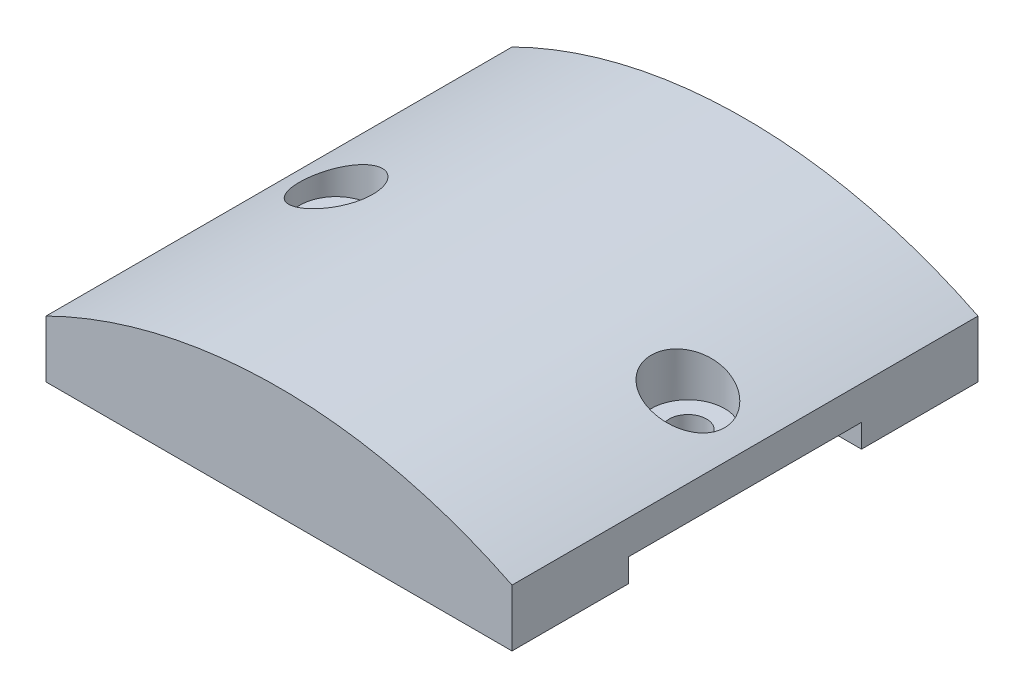
ISO-10303-21;
HEADER;
FILE_DESCRIPTION(('STEP AP214'),'2;1');
FILE_NAME('part.step','',(''),(''),'','','');
FILE_SCHEMA(('AUTOMOTIVE_DESIGN { 1 0 10303 214 1 1 1 1 }'));
ENDSEC;
DATA;
#1=APPLICATION_CONTEXT('core data for automotive mechanical design processes');
#2=APPLICATION_PROTOCOL_DEFINITION('international standard','automotive_design',2000,#1);
#3=PRODUCT_CONTEXT('',#1,'mechanical');
#4=PRODUCT('Part','Part','',(#3));
#5=PRODUCT_RELATED_PRODUCT_CATEGORY('part','',(#4));
#6=PRODUCT_DEFINITION_FORMATION('','',#4);
#7=PRODUCT_DEFINITION_CONTEXT('part definition',#1,'design');
#8=PRODUCT_DEFINITION('design','',#6,#7);
#9=PRODUCT_DEFINITION_SHAPE('','',#8);
#10=(LENGTH_UNIT() NAMED_UNIT(*) SI_UNIT(.MILLI.,.METRE.));
#11=(NAMED_UNIT(*) PLANE_ANGLE_UNIT() SI_UNIT($,.RADIAN.));
#12=(NAMED_UNIT(*) SI_UNIT($,.STERADIAN.) SOLID_ANGLE_UNIT());
#13=UNCERTAINTY_MEASURE_WITH_UNIT(LENGTH_MEASURE(1.E-05),#10,'distance_accuracy_value','');
#14=(GEOMETRIC_REPRESENTATION_CONTEXT(3) GLOBAL_UNCERTAINTY_ASSIGNED_CONTEXT((#13)) GLOBAL_UNIT_ASSIGNED_CONTEXT((#10,
#11,#12)) REPRESENTATION_CONTEXT('',''));
#15=CARTESIAN_POINT('',(0.,0.,0.));
#16=DIRECTION('',(0.,0.,1.));
#17=DIRECTION('',(1.,0.,0.));
#18=AXIS2_PLACEMENT_3D('',#15,#16,#17);
#19=CARTESIAN_POINT('',(-20.,37.4112887414927,40.));
#20=DIRECTION('',(0.,1.,0.));
#21=DIRECTION('',(0.,0.,1.));
#22=AXIS2_PLACEMENT_3D('',#19,#20,#21);
#23=PLANE('',#22);
#24=CARTESIAN_POINT('',(15.1,37.4112887414927,20.));
#25=DIRECTION('',(0.,-1.,0.));
#26=DIRECTION('',(0.,0.,-1.));
#27=AXIS2_PLACEMENT_3D('',#24,#25,#26);
#28=CIRCLE('',#27,1.6);
#29=CARTESIAN_POINT('',(15.1,37.4112887414927,18.4));
#30=VERTEX_POINT('',#29);
#31=EDGE_CURVE('E180',#30,#30,#28,.T.);
#32=ORIENTED_EDGE('',*,*,#31,.F.);
#33=EDGE_LOOP('',(#32));
#34=FACE_BOUND('',#33,.T.);
#35=CARTESIAN_POINT('',(-15.1,37.4112887414927,20.));
#36=DIRECTION('',(0.,-1.,0.));
#37=DIRECTION('',(0.,0.,-1.));
#38=AXIS2_PLACEMENT_3D('',#35,#36,#37);
#39=CIRCLE('',#38,1.6);
#40=CARTESIAN_POINT('',(-15.1,37.4112887414927,18.4));
#41=VERTEX_POINT('',#40);
#42=EDGE_CURVE('E184',#41,#41,#39,.T.);
#43=ORIENTED_EDGE('',*,*,#42,.F.);
#44=EDGE_LOOP('',(#43));
#45=FACE_BOUND('',#44,.T.);
#46=DIRECTION('',(-1.,0.,0.));
#47=VECTOR('',#46,1.);
#48=CARTESIAN_POINT('',(20.,37.4112887414927,10.));
#49=LINE('',#48,#47);
#50=CARTESIAN_POINT('',(20.,37.4112887414927,10.));
#51=VERTEX_POINT('',#50);
#52=CARTESIAN_POINT('',(-20.,37.4112887414927,10.));
#53=VERTEX_POINT('',#52);
#54=EDGE_CURVE('E53',#51,#53,#49,.T.);
#55=ORIENTED_EDGE('',*,*,#54,.F.);
#56=DIRECTION('',(0.,0.,-1.));
#57=VECTOR('',#56,1.);
#58=CARTESIAN_POINT('',(20.,37.4112887414927,40.));
#59=LINE('',#58,#57);
#60=CARTESIAN_POINT('',(20.,37.4112887414927,30.));
#61=VERTEX_POINT('',#60);
#62=EDGE_CURVE('E119',#61,#51,#59,.T.);
#63=ORIENTED_EDGE('',*,*,#62,.F.);
#64=DIRECTION('',(1.,0.,0.));
#65=VECTOR('',#64,1.);
#66=CARTESIAN_POINT('',(20.,37.4112887414927,30.));
#67=LINE('',#66,#65);
#68=CARTESIAN_POINT('',(-20.,37.4112887414927,30.));
#69=VERTEX_POINT('',#68);
#70=EDGE_CURVE('E120',#69,#61,#67,.T.);
#71=ORIENTED_EDGE('',*,*,#70,.F.);
#72=DIRECTION('',(0.,0.,-1.));
#73=VECTOR('',#72,1.);
#74=CARTESIAN_POINT('',(-20.,37.4112887414927,40.));
#75=LINE('',#74,#73);
#76=EDGE_CURVE('E43',#69,#53,#75,.T.);
#77=ORIENTED_EDGE('',*,*,#76,.T.);
#78=EDGE_LOOP('',(#55,#63,#71,#77));
#79=FACE_BOUND('',#78,.T.);
#80=ADVANCED_FACE('F35',(#34,#45,#79),#23,.F.);
#81=CARTESIAN_POINT('',(0.,0.,40.));
#82=DIRECTION('',(0.,0.,-1.));
#83=DIRECTION('',(-1.,0.,0.));
#84=AXIS2_PLACEMENT_3D('',#81,#82,#83);
#85=CYLINDRICAL_SURFACE('',#84,45.);
#86=CARTESIAN_POINT('',(15.1,42.3909188388268,16.85));
#87=CARTESIAN_POINT('',(14.917921162433,42.4557751359919,16.8500064354396));
#88=CARTESIAN_POINT('',(14.7353063218418,42.5194905619272,16.8658227416837));
#89=CARTESIAN_POINT('',(14.3741346155636,42.6429451034299,16.9292855592987));
#90=CARTESIAN_POINT('',(14.1955817473311,42.7026804048673,16.9769621331173));
#91=CARTESIAN_POINT('',(13.847741264861,42.8167444908639,17.103684490772));
#92=CARTESIAN_POINT('',(13.6784678605518,42.8710650823666,17.1827769353212));
#93=CARTESIAN_POINT('',(13.3551221756986,42.9728922456674,17.3707702781144));
#94=CARTESIAN_POINT('',(13.2010442954167,43.0204013305405,17.4796601393828));
#95=CARTESIAN_POINT('',(12.9189423413911,43.1059379927211,17.7199711002173));
#96=CARTESIAN_POINT('',(12.7901603329951,43.1442533330929,17.8503992451927));
#97=CARTESIAN_POINT('',(12.5563761210181,43.2128719655159,18.1328991703156));
#98=CARTESIAN_POINT('',(12.4513684397311,43.2431771034218,18.284965951653));
#99=CARTESIAN_POINT('',(12.2732307987915,43.2940646322592,18.5989379034497));
#100=CARTESIAN_POINT('',(12.1988724088376,43.3150252294352,18.760085493556));
#101=CARTESIAN_POINT('',(12.0781068182708,43.3488558264082,19.0933300262607));
#102=CARTESIAN_POINT('',(12.0316942010325,43.3617273940928,19.265424839845));
#103=CARTESIAN_POINT('',(11.9694548412235,43.3789484461706,19.6101757891508));
#104=CARTESIAN_POINT('',(11.9527621965356,43.3835392481825,19.7826640537202));
#105=CARTESIAN_POINT('',(11.9478702820662,43.3848868478971,20.1280676332819));
#106=CARTESIAN_POINT('',(11.9596684319076,43.381644355052,20.3009829081834));
#107=CARTESIAN_POINT('',(12.0110599112159,43.3674431511606,20.640387344238));
#108=CARTESIAN_POINT('',(12.0503532095443,43.3565677279551,20.8069255909907));
#109=CARTESIAN_POINT('',(12.1550690359214,43.3273265891101,21.1308663340762));
#110=CARTESIAN_POINT('',(12.2204916292976,43.3089608547435,21.2882688075671));
#111=CARTESIAN_POINT('',(12.3758678439609,43.2648175111449,21.5908307864634));
#112=CARTESIAN_POINT('',(12.4660017952911,43.2389853376347,21.7358895987553));
#113=CARTESIAN_POINT('',(12.6676319914819,43.1803438237324,22.0086976141677));
#114=CARTESIAN_POINT('',(12.7791301407995,43.1475338612944,22.1364452723949));
#115=CARTESIAN_POINT('',(13.023047495167,43.0745493728572,22.374560845027));
#116=CARTESIAN_POINT('',(13.1559217157993,43.0342106139224,22.4844118250061));
#117=CARTESIAN_POINT('',(13.4363869906596,42.9474683512401,22.6803305244605));
#118=CARTESIAN_POINT('',(13.5839805819532,42.9010638015489,22.7663941342134));
#119=CARTESIAN_POINT('',(13.8958741094954,42.8010810095133,22.9161102700115));
#120=CARTESIAN_POINT('',(14.0606086563789,42.7472882800563,22.97871339931));
#121=CARTESIAN_POINT('',(14.3967693526546,42.6352487919911,23.0754808994123));
#122=CARTESIAN_POINT('',(14.5681970584752,42.5770009943441,23.1096386137813));
#123=CARTESIAN_POINT('',(14.9214726795755,42.4545193440612,23.1501935375199));
#124=CARTESIAN_POINT('',(15.1034283496834,42.3901325432662,23.1551928316704));
#125=CARTESIAN_POINT('',(15.4648938317966,42.2596027134132,23.1340311888419));
#126=CARTESIAN_POINT('',(15.6444030415979,42.1934592633567,23.1078627150956));
#127=CARTESIAN_POINT('',(16.0027077688299,42.0589022597986,23.0236878442042));
#128=CARTESIAN_POINT('',(16.1812444826261,41.9904927898198,22.964568171481));
#129=CARTESIAN_POINT('',(16.5257817195087,41.8560959125334,22.8151220990332));
#130=CARTESIAN_POINT('',(16.691780640312,41.7901088153479,22.724791718892));
#131=CARTESIAN_POINT('',(17.0060463070567,41.6632102259937,22.514979912102));
#132=CARTESIAN_POINT('',(17.1543400429,41.6022910523756,22.3955437222389));
#133=CARTESIAN_POINT('',(17.4284539867978,41.4882039340175,22.1300630340163));
#134=CARTESIAN_POINT('',(17.5542806853583,41.4350337514887,21.9840262450164));
#135=CARTESIAN_POINT('',(17.7723619962926,41.341945863629,21.6776187455801));
#136=CARTESIAN_POINT('',(17.8660664570793,41.3014661158964,21.5184537478712));
#137=CARTESIAN_POINT('',(18.0248385245567,41.2324235274573,21.1840637020472));
#138=CARTESIAN_POINT('',(18.0899249056515,41.2038528746337,21.0088492743386));
#139=CARTESIAN_POINT('',(18.1841906728487,41.1623328865027,20.6630828080986));
#140=CARTESIAN_POINT('',(18.2159026241262,41.148283517025,20.4933514903046));
#141=CARTESIAN_POINT('',(18.2511166924421,41.1326772356729,20.1504411089416));
#142=CARTESIAN_POINT('',(18.2546297306281,41.1311154874728,19.9772634061744));
#143=CARTESIAN_POINT('',(18.2338972771202,41.1403096900502,19.6425838061022));
#144=CARTESIAN_POINT('',(18.2111756035592,41.1503894634211,19.4809656972016));
#145=CARTESIAN_POINT('',(18.1414074235976,41.1811944356611,19.1641460807923));
#146=CARTESIAN_POINT('',(18.0943607880927,41.201919691031,19.0089446073445));
#147=CARTESIAN_POINT('',(17.9772301319571,41.2531609788929,18.7075443839803));
#148=CARTESIAN_POINT('',(17.9069339320577,41.2837671221187,18.5614438575329));
#149=CARTESIAN_POINT('',(17.7459092207638,41.3532389655789,18.2831636854008));
#150=CARTESIAN_POINT('',(17.6551765703296,41.3921063388887,18.150986867686));
#151=CARTESIAN_POINT('',(17.4497436989419,41.4791469123823,17.8952987367199));
#152=CARTESIAN_POINT('',(17.3338920891559,41.5277526599914,17.7728610952463));
#153=CARTESIAN_POINT('',(17.0855884575112,41.6305262958042,17.5488930855934));
#154=CARTESIAN_POINT('',(16.9531269189506,41.6846973694348,17.4473747920629));
#155=CARTESIAN_POINT('',(16.6640135366599,41.8011577382072,17.2598638916752));
#156=CARTESIAN_POINT('',(16.5062773516966,41.8637502912335,17.1757313857386));
#157=CARTESIAN_POINT('',(16.1797325558968,41.9910334508196,17.0355075399543));
#158=CARTESIAN_POINT('',(16.0109323976939,42.0557224370805,16.9793950694846));
#159=CARTESIAN_POINT('',(15.718014495221,42.1658715545149,16.9087222464358));
#160=CARTESIAN_POINT('',(15.5956192419095,42.2113007476435,16.8867555131053));
#161=CARTESIAN_POINT('',(15.3488996785549,42.3016376037237,16.8573919009266));
#162=CARTESIAN_POINT('',(15.2245752925897,42.3465452460272,16.8499955969799));
#163=CARTESIAN_POINT('',(15.1,42.3909188388268,16.85));
#164=B_SPLINE_CURVE_WITH_KNOTS('',3,(#86,#87,#88,#89,#90,#91,#92,#93,#94,#95,#96,#97,#98,#99,
#100,#101,#102,#103,#104,#105,#106,#107,#108,#109,#110,#111,#112,#113,#114,#115,#116,#117,#118,
#119,#120,#121,#122,#123,#124,#125,#126,#127,#128,#129,#130,#131,#132,#133,#134,#135,#136,#137,
#138,#139,#140,#141,#142,#143,#144,#145,#146,#147,#148,#149,#150,#151,#152,#153,#154,#155,#156,
#157,#158,#159,#160,#161,#162,#163),.UNSPECIFIED.,.T.,.F.,(4,2,2,2,2,2,2,2,2,2,2,2,2,2,2,2,2,2,
2,2,2,2,2,2,2,2,2,2,2,2,2,2,2,2,2,2,2,2,4),(0.,0.579395684925988,1.159338844628,
1.74014661062104,2.3207395356927,2.87965661111088,3.43844477830876,3.97192347129547,
4.50529872877518,5.02286260412831,5.54037960610012,6.05233570748208,6.56429308884739,
7.08009074524877,7.59593440252669,8.12473051713854,8.65361793435104,9.20393576786858,
9.7543823436217,10.3310145919905,10.9077863057725,11.5053415324013,12.1029729955964,
12.6996814674976,13.2962172763012,13.8604245885577,14.4242612079383,14.9412844575764,
15.4581074597871,15.946359315351,16.4346137623279,16.9274530601218,17.4203922636516,
17.9444476355004,18.4688046500611,19.0345858023868,19.5999396379469,19.9963368260331,
20.3927496543404),.UNSPECIFIED.);
#165=CARTESIAN_POINT('',(15.1,42.3909188388268,16.85));
#166=VERTEX_POINT('',#165);
#167=EDGE_CURVE('E146',#166,#166,#164,.T.);
#168=ORIENTED_EDGE('',*,*,#167,.F.);
#169=EDGE_LOOP('',(#168));
#170=FACE_BOUND('',#169,.T.);
#171=CARTESIAN_POINT('',(-15.1,42.3909188388268,16.85));
#172=CARTESIAN_POINT('',(-15.2881124933887,42.3239094742285,16.8500072405214));
#173=CARTESIAN_POINT('',(-15.4759275591287,42.2555840182287,16.8668931099648));
#174=CARTESIAN_POINT('',(-15.8455928341878,42.1183595938039,16.9337365806963));
#175=CARTESIAN_POINT('',(-16.0274334172963,42.0494599044929,16.9837450467161));
#176=CARTESIAN_POINT('',(-16.3799166486515,41.9134108283723,17.1156104386975));
#177=CARTESIAN_POINT('',(-16.5505596591366,41.8462613849852,17.1974663338097));
#178=CARTESIAN_POINT('',(-16.8756017351511,41.7162405786856,17.3912600023276));
#179=CARTESIAN_POINT('',(-17.0300062638385,41.6533677795006,17.5031876132823));
#180=CARTESIAN_POINT('',(-17.3149832665825,41.5357042230986,17.7524395200131));
#181=CARTESIAN_POINT('',(-17.4459367428031,41.4807877066122,17.8892671015941));
#182=CARTESIAN_POINT('',(-17.6824993915352,41.3804998452969,18.1863836138832));
#183=CARTESIAN_POINT('',(-17.7881189079361,41.3351246056886,18.3466629260342));
#184=CARTESIAN_POINT('',(-17.9630436364983,41.2593934751678,18.6742814139124));
#185=CARTESIAN_POINT('',(-18.0343665192322,41.2282113044505,18.8403503114985));
#186=CARTESIAN_POINT('',(-18.1478202358163,41.1783986352912,19.1839367297323));
#187=CARTESIAN_POINT('',(-18.1899693621524,41.1597602718528,19.3614469999532));
#188=CARTESIAN_POINT('',(-18.2408739082115,41.137224275827,19.7075324610461));
#189=CARTESIAN_POINT('',(-18.2520268029631,41.1322685530485,19.8756895041256));
#190=CARTESIAN_POINT('',(-18.2473693471447,41.1343351258476,20.2115352230956));
#191=CARTESIAN_POINT('',(-18.2315653214583,41.1413546116903,20.3792239996091));
#192=CARTESIAN_POINT('',(-18.1747081431594,41.1665019746474,20.7034581008569));
#193=CARTESIAN_POINT('',(-18.1345289797678,41.1842452625123,20.8601884799997));
#194=CARTESIAN_POINT('',(-18.0312948370746,41.2295471978183,21.164396956171));
#195=CARTESIAN_POINT('',(-17.9682375027795,41.2571068557145,21.3118740988723));
#196=CARTESIAN_POINT('',(-17.8191448904608,41.3217237611645,21.5986557537818));
#197=CARTESIAN_POINT('',(-17.7324403983181,41.3590560942391,21.7375491272159));
#198=CARTESIAN_POINT('',(-17.5399145900048,41.4410705577026,21.998921786049));
#199=CARTESIAN_POINT('',(-17.4340875964544,41.485754870506,22.1213961778686));
#200=CARTESIAN_POINT('',(-17.1978927177011,41.5842518504236,22.3560684520519));
#201=CARTESIAN_POINT('',(-17.0662908796495,41.638494596772,22.4668433687524));
#202=CARTESIAN_POINT('',(-16.7881681015295,41.7514065129923,22.664913598653));
#203=CARTESIAN_POINT('',(-16.6416418856634,41.8100772462547,22.7522005688282));
#204=CARTESIAN_POINT('',(-16.326084479267,41.9343503611774,22.9072909501269));
#205=CARTESIAN_POINT('',(-16.1561907061596,42.0001451975729,22.9731894877233));
#206=CARTESIAN_POINT('',(-15.8078614471808,42.1324844412606,23.0747953013084));
#207=CARTESIAN_POINT('',(-15.629423851712,42.199029030544,23.1104950797292));
#208=CARTESIAN_POINT('',(-15.2619700767349,42.3333424478927,23.1514549150258));
#209=CARTESIAN_POINT('',(-15.0728059740975,42.4010666134936,23.1555500776055));
#210=CARTESIAN_POINT('',(-14.6956465775453,42.5332564407386,23.1296521308203));
#211=CARTESIAN_POINT('',(-14.5076512716343,42.5977221358751,23.0996593719049));
#212=CARTESIAN_POINT('',(-14.1407804894186,42.7209004657908,23.0062919303004));
#213=CARTESIAN_POINT('',(-13.961822875223,42.779672645715,22.9433204603148));
#214=CARTESIAN_POINT('',(-13.6165167261907,42.8908309412006,22.7852829268663));
#215=CARTESIAN_POINT('',(-13.450165141238,42.943218603418,22.6902246575832));
#216=CARTESIAN_POINT('',(-13.142864944297,43.0382375170427,22.4750282174879));
#217=CARTESIAN_POINT('',(-13.0011246684806,43.0811947144011,22.356165218644));
#218=CARTESIAN_POINT('',(-12.7396351905537,43.1592440710589,22.0941356006051));
#219=CARTESIAN_POINT('',(-12.6198796326398,43.1943385041399,21.9509760286794));
#220=CARTESIAN_POINT('',(-12.4119968604404,43.254520265744,21.6518809203537));
#221=CARTESIAN_POINT('',(-12.3226273392947,43.2800070985417,21.4968885531198));
#222=CARTESIAN_POINT('',(-12.171125978643,43.3228568752059,21.1730831344086));
#223=CARTESIAN_POINT('',(-12.1089882378382,43.3402215792441,21.0042730867295));
#224=CARTESIAN_POINT('',(-12.0158857779409,43.3661245298059,20.6639240680891));
#225=CARTESIAN_POINT('',(-11.9839200218119,43.3749464866356,20.4926799183945));
#226=CARTESIAN_POINT('',(-11.9486445746038,43.3846774861953,20.1470492932151));
#227=CARTESIAN_POINT('',(-11.9453315995885,43.3855874357318,19.972663180131));
#228=CARTESIAN_POINT('',(-11.9672981537529,43.3795330833994,19.6286105455623));
#229=CARTESIAN_POINT('',(-11.992128762669,43.3726924128213,19.4589129332231));
#230=CARTESIAN_POINT('',(-12.0687993275228,43.3514203787888,19.1262386345274));
#231=CARTESIAN_POINT('',(-12.1206388074132,43.3369891491223,18.9632618297674));
#232=CARTESIAN_POINT('',(-12.249750616349,43.3006707870141,18.6480898579962));
#233=CARTESIAN_POINT('',(-12.3270926911493,43.2787632020566,18.4959256647063));
#234=CARTESIAN_POINT('',(-12.5046050755418,43.2278075661563,18.2069041649482));
#235=CARTESIAN_POINT('',(-12.6047759308417,43.1987593445198,18.0700472245069));
#236=CARTESIAN_POINT('',(-12.8270164074501,43.1332969409293,17.8124040495364));
#237=CARTESIAN_POINT('',(-12.9494915078972,43.0967444323859,17.6920031364317));
#238=CARTESIAN_POINT('',(-13.2111037011557,43.0172687030616,17.4734121920865));
#239=CARTESIAN_POINT('',(-13.3502473481991,42.9743429746709,17.3752309419611));
#240=CARTESIAN_POINT('',(-13.646524573283,42.881200449775,17.1998846976603));
#241=CARTESIAN_POINT('',(-13.8041361022754,42.830771141335,17.1236421318017));
#242=CARTESIAN_POINT('',(-14.1281768868221,42.7249761304091,16.9986375897571));
#243=CARTESIAN_POINT('',(-14.2945979491198,42.6696149831233,16.9498505534397));
#244=CARTESIAN_POINT('',(-14.5682633685241,42.5767318153474,16.8933460177845));
#245=CARTESIAN_POINT('',(-14.6742080080857,42.5403370317983,16.8770822199263));
#246=CARTESIAN_POINT('',(-14.8868002395262,42.4664085322157,16.8554071466131));
#247=CARTESIAN_POINT('',(-14.9934478331926,42.428874813285,16.8499958987666));
#248=CARTESIAN_POINT('',(-15.1,42.3909188388268,16.85));
#249=B_SPLINE_CURVE_WITH_KNOTS('',3,(#171,#172,#173,#174,#175,#176,#177,#178,#179,#180,#181,
#182,#183,#184,#185,#186,#187,#188,#189,#190,#191,#192,#193,#194,#195,#196,#197,#198,#199,#200,
#201,#202,#203,#204,#205,#206,#207,#208,#209,#210,#211,#212,#213,#214,#215,#216,#217,#218,#219,
#220,#221,#222,#223,#224,#225,#226,#227,#228,#229,#230,#231,#232,#233,#234,#235,#236,#237,#238,
#239,#240,#241,#242,#243,#244,#245,#246,#247,#248),.UNSPECIFIED.,.T.,.F.,(4,2,2,2,2,2,2,2,2,2,2,
2,2,2,2,2,2,2,2,2,2,2,2,2,2,2,2,2,2,2,2,2,2,2,2,2,2,2,4),(0.,0.598660568588378,1.19824260870438,
1.79780524293847,2.39716551497199,2.98566992552863,3.57393363836162,4.12120428776926,
4.66813147672197,5.17139204069942,5.67453454123944,6.16062277292686,6.64676105492449,
7.14841703545151,7.65022220071009,8.18901649948528,8.72800192856056,9.30662423224186,
9.88539015068873,10.4853910508739,11.0853857826553,11.678210301605,12.2708909215101,
12.8377131498769,13.4043712504348,13.9438279840213,14.4831677560473,15.0039097895349,
15.524592139245,16.0370845227508,16.5495678735821,17.063464577629,17.5773735673442,
18.1017787494138,18.6263908136574,19.170606503162,19.7143246488484,20.0534218419195,
20.392519897642),.UNSPECIFIED.);
#250=CARTESIAN_POINT('',(-15.1,42.3909188388268,16.85));
#251=VERTEX_POINT('',#250);
#252=EDGE_CURVE('E147',#251,#251,#249,.T.);
#253=ORIENTED_EDGE('',*,*,#252,.F.);
#254=EDGE_LOOP('',(#253));
#255=FACE_BOUND('',#254,.T.);
#256=CARTESIAN_POINT('',(0.,0.,0.));
#257=DIRECTION('',(0.,0.,1.));
#258=DIRECTION('',(1.,0.,0.));
#259=AXIS2_PLACEMENT_3D('',#256,#257,#258);
#260=CIRCLE('',#259,45.);
#261=CARTESIAN_POINT('',(20.,40.3112887414928,0.));
#262=VERTEX_POINT('',#261);
#263=CARTESIAN_POINT('',(-20.,40.3112887414928,0.));
#264=VERTEX_POINT('',#263);
#265=EDGE_CURVE('E183',#262,#264,#260,.T.);
#266=ORIENTED_EDGE('',*,*,#265,.T.);
#267=DIRECTION('',(0.,0.,-1.));
#268=VECTOR('',#267,1.);
#269=CARTESIAN_POINT('',(-20.,40.3112887414928,40.));
#270=LINE('',#269,#268);
#271=CARTESIAN_POINT('',(-20.,40.3112887414928,40.));
#272=VERTEX_POINT('',#271);
#273=EDGE_CURVE('E11',#272,#264,#270,.T.);
#274=ORIENTED_EDGE('',*,*,#273,.F.);
#275=CARTESIAN_POINT('',(0.,0.,40.));
#276=DIRECTION('',(0.,0.,1.));
#277=DIRECTION('',(1.,0.,0.));
#278=AXIS2_PLACEMENT_3D('',#275,#276,#277);
#279=CIRCLE('',#278,45.);
#280=CARTESIAN_POINT('',(20.,40.3112887414928,40.));
#281=VERTEX_POINT('',#280);
#282=EDGE_CURVE('E189',#281,#272,#279,.T.);
#283=ORIENTED_EDGE('',*,*,#282,.F.);
#284=DIRECTION('',(0.,0.,-1.));
#285=VECTOR('',#284,1.);
#286=CARTESIAN_POINT('',(20.,40.3112887414928,40.));
#287=LINE('',#286,#285);
#288=EDGE_CURVE('E197',#281,#262,#287,.T.);
#289=ORIENTED_EDGE('',*,*,#288,.T.);
#290=EDGE_LOOP('',(#266,#274,#283,#289));
#291=FACE_BOUND('',#290,.T.);
#292=ADVANCED_FACE('F37',(#170,#255,#291),#85,.T.);
#293=CARTESIAN_POINT('',(-20.,40.3112887414928,40.));
#294=DIRECTION('',(1.,0.,0.));
#295=DIRECTION('',(0.,0.,-1.));
#296=AXIS2_PLACEMENT_3D('',#293,#294,#295);
#297=PLANE('',#296);
#298=DIRECTION('',(0.,-1.,0.));
#299=VECTOR('',#298,1.);
#300=CARTESIAN_POINT('',(-20.,40.3112887414928,0.));
#301=LINE('',#300,#299);
#302=CARTESIAN_POINT('',(-20.,35.4112887414927,0.));
#303=VERTEX_POINT('',#302);
#304=EDGE_CURVE('E200',#264,#303,#301,.T.);
#305=ORIENTED_EDGE('',*,*,#304,.T.);
#306=DIRECTION('',(0.,0.,-1.));
#307=VECTOR('',#306,1.);
#308=CARTESIAN_POINT('',(-20.,35.4112887414927,0.));
#309=LINE('',#308,#307);
#310=CARTESIAN_POINT('',(-20.,35.4112887414927,10.));
#311=VERTEX_POINT('',#310);
#312=EDGE_CURVE('E107',#311,#303,#309,.T.);
#313=ORIENTED_EDGE('',*,*,#312,.F.);
#314=DIRECTION('',(0.,1.,0.));
#315=VECTOR('',#314,1.);
#316=CARTESIAN_POINT('',(-20.,35.4112887414927,10.));
#317=LINE('',#316,#315);
#318=EDGE_CURVE('E103',#311,#53,#317,.T.);
#319=ORIENTED_EDGE('',*,*,#318,.T.);
#320=ORIENTED_EDGE('',*,*,#76,.F.);
#321=DIRECTION('',(0.,1.,0.));
#322=VECTOR('',#321,1.);
#323=CARTESIAN_POINT('',(-20.,35.4112887414927,30.));
#324=LINE('',#323,#322);
#325=CARTESIAN_POINT('',(-20.,35.4112887414927,30.));
#326=VERTEX_POINT('',#325);
#327=EDGE_CURVE('E139',#326,#69,#324,.T.);
#328=ORIENTED_EDGE('',*,*,#327,.F.);
#329=DIRECTION('',(0.,0.,-1.));
#330=VECTOR('',#329,1.);
#331=CARTESIAN_POINT('',(-20.,35.4112887414927,40.));
#332=LINE('',#331,#330);
#333=CARTESIAN_POINT('',(-20.,35.4112887414927,40.));
#334=VERTEX_POINT('',#333);
#335=EDGE_CURVE('E133',#334,#326,#332,.T.);
#336=ORIENTED_EDGE('',*,*,#335,.F.);
#337=DIRECTION('',(0.,-1.,0.));
#338=VECTOR('',#337,1.);
#339=CARTESIAN_POINT('',(-20.,40.3112887414928,40.));
#340=LINE('',#339,#338);
#341=EDGE_CURVE('E192',#272,#334,#340,.T.);
#342=ORIENTED_EDGE('',*,*,#341,.F.);
#343=ORIENTED_EDGE('',*,*,#273,.T.);
#344=EDGE_LOOP('',(#305,#313,#319,#320,#328,#336,#342,#343));
#345=FACE_BOUND('',#344,.T.);
#346=ADVANCED_FACE('F213',(#345),#297,.F.);
#347=CARTESIAN_POINT('',(20.,37.4112887414927,40.));
#348=DIRECTION('',(-1.,0.,0.));
#349=DIRECTION('',(0.,0.,1.));
#350=AXIS2_PLACEMENT_3D('',#347,#348,#349);
#351=PLANE('',#350);
#352=DIRECTION('',(0.,1.,0.));
#353=VECTOR('',#352,1.);
#354=CARTESIAN_POINT('',(20.,37.4112887414927,0.));
#355=LINE('',#354,#353);
#356=CARTESIAN_POINT('',(20.,35.4112887414927,0.));
#357=VERTEX_POINT('',#356);
#358=EDGE_CURVE('E193',#357,#262,#355,.T.);
#359=ORIENTED_EDGE('',*,*,#358,.T.);
#360=ORIENTED_EDGE('',*,*,#288,.F.);
#361=DIRECTION('',(0.,1.,0.));
#362=VECTOR('',#361,1.);
#363=CARTESIAN_POINT('',(20.,37.4112887414927,40.));
#364=LINE('',#363,#362);
#365=CARTESIAN_POINT('',(20.,35.4112887414927,40.));
#366=VERTEX_POINT('',#365);
#367=EDGE_CURVE('E195',#366,#281,#364,.T.);
#368=ORIENTED_EDGE('',*,*,#367,.F.);
#369=DIRECTION('',(0.,0.,1.));
#370=VECTOR('',#369,1.);
#371=CARTESIAN_POINT('',(20.,35.4112887414927,40.));
#372=LINE('',#371,#370);
#373=CARTESIAN_POINT('',(20.,35.4112887414927,30.));
#374=VERTEX_POINT('',#373);
#375=EDGE_CURVE('E123',#374,#366,#372,.T.);
#376=ORIENTED_EDGE('',*,*,#375,.F.);
#377=DIRECTION('',(0.,1.,0.));
#378=VECTOR('',#377,1.);
#379=CARTESIAN_POINT('',(20.,35.4112887414927,30.));
#380=LINE('',#379,#378);
#381=EDGE_CURVE('E136',#374,#61,#380,.T.);
#382=ORIENTED_EDGE('',*,*,#381,.T.);
#383=ORIENTED_EDGE('',*,*,#62,.T.);
#384=DIRECTION('',(0.,1.,0.));
#385=VECTOR('',#384,1.);
#386=CARTESIAN_POINT('',(20.,35.4112887414927,10.));
#387=LINE('',#386,#385);
#388=CARTESIAN_POINT('',(20.,35.4112887414927,10.));
#389=VERTEX_POINT('',#388);
#390=EDGE_CURVE('E101',#389,#51,#387,.T.);
#391=ORIENTED_EDGE('',*,*,#390,.F.);
#392=DIRECTION('',(0.,0.,1.));
#393=VECTOR('',#392,1.);
#394=CARTESIAN_POINT('',(20.,35.4112887414927,0.));
#395=LINE('',#394,#393);
#396=EDGE_CURVE('E108',#357,#389,#395,.T.);
#397=ORIENTED_EDGE('',*,*,#396,.F.);
#398=EDGE_LOOP('',(#359,#360,#368,#376,#382,#383,#391,#397));
#399=FACE_BOUND('',#398,.T.);
#400=ADVANCED_FACE('F117',(#399),#351,.F.);
#401=CARTESIAN_POINT('',(0.,0.,40.));
#402=DIRECTION('',(0.,0.,1.));
#403=DIRECTION('',(1.,0.,0.));
#404=AXIS2_PLACEMENT_3D('',#401,#402,#403);
#405=PLANE('',#404);
#406=ORIENTED_EDGE('',*,*,#282,.T.);
#407=ORIENTED_EDGE('',*,*,#341,.T.);
#408=DIRECTION('',(-1.,0.,0.));
#409=VECTOR('',#408,1.);
#410=CARTESIAN_POINT('',(20.,35.4112887414927,40.));
#411=LINE('',#410,#409);
#412=EDGE_CURVE('E130',#366,#334,#411,.T.);
#413=ORIENTED_EDGE('',*,*,#412,.F.);
#414=ORIENTED_EDGE('',*,*,#367,.T.);
#415=EDGE_LOOP('',(#406,#407,#413,#414));
#416=FACE_BOUND('',#415,.T.);
#417=ADVANCED_FACE('F218',(#416),#405,.T.);
#418=CARTESIAN_POINT('',(0.,0.,0.));
#419=DIRECTION('',(0.,0.,1.));
#420=DIRECTION('',(1.,0.,0.));
#421=AXIS2_PLACEMENT_3D('',#418,#419,#420);
#422=PLANE('',#421);
#423=ORIENTED_EDGE('',*,*,#265,.F.);
#424=ORIENTED_EDGE('',*,*,#358,.F.);
#425=DIRECTION('',(1.,0.,0.));
#426=VECTOR('',#425,1.);
#427=CARTESIAN_POINT('',(20.,35.4112887414927,0.));
#428=LINE('',#427,#426);
#429=EDGE_CURVE('E114',#303,#357,#428,.T.);
#430=ORIENTED_EDGE('',*,*,#429,.F.);
#431=ORIENTED_EDGE('',*,*,#304,.F.);
#432=EDGE_LOOP('',(#423,#424,#430,#431));
#433=FACE_BOUND('',#432,.T.);
#434=ADVANCED_FACE('F211',(#433),#422,.F.);
#435=CARTESIAN_POINT('',(-15.1,39.4112887414928,20.));
#436=DIRECTION('',(0.,-1.,0.));
#437=DIRECTION('',(0.,0.,-1.));
#438=AXIS2_PLACEMENT_3D('',#435,#436,#437);
#439=CYLINDRICAL_SURFACE('',#438,1.6);
#440=CARTESIAN_POINT('',(-15.1,39.4112887414928,20.));
#441=DIRECTION('',(0.,-1.,0.));
#442=DIRECTION('',(0.,0.,-1.));
#443=AXIS2_PLACEMENT_3D('',#440,#441,#442);
#444=CIRCLE('',#443,1.6);
#445=CARTESIAN_POINT('',(-15.1,39.4112887414928,18.4));
#446=VERTEX_POINT('',#445);
#447=EDGE_CURVE('E179',#446,#446,#444,.T.);
#448=ORIENTED_EDGE('',*,*,#447,.F.);
#449=EDGE_LOOP('',(#448));
#450=FACE_BOUND('',#449,.T.);
#451=ORIENTED_EDGE('',*,*,#42,.T.);
#452=EDGE_LOOP('',(#451));
#453=FACE_BOUND('',#452,.T.);
#454=ADVANCED_FACE('F250',(#450,#453),#439,.F.);
#455=CARTESIAN_POINT('',(15.1,39.4112887414928,20.));
#456=DIRECTION('',(0.,-1.,0.));
#457=DIRECTION('',(0.,0.,-1.));
#458=AXIS2_PLACEMENT_3D('',#455,#456,#457);
#459=CYLINDRICAL_SURFACE('',#458,1.6);
#460=CARTESIAN_POINT('',(15.1,39.4112887414928,20.));
#461=DIRECTION('',(0.,-1.,0.));
#462=DIRECTION('',(0.,0.,-1.));
#463=AXIS2_PLACEMENT_3D('',#460,#461,#462);
#464=CIRCLE('',#463,1.6);
#465=CARTESIAN_POINT('',(15.1,39.4112887414928,18.4));
#466=VERTEX_POINT('',#465);
#467=EDGE_CURVE('E154',#466,#466,#464,.T.);
#468=ORIENTED_EDGE('',*,*,#467,.F.);
#469=EDGE_LOOP('',(#468));
#470=FACE_BOUND('',#469,.T.);
#471=ORIENTED_EDGE('',*,*,#31,.T.);
#472=EDGE_LOOP('',(#471));
#473=FACE_BOUND('',#472,.T.);
#474=ADVANCED_FACE('F169',(#470,#473),#459,.F.);
#475=CARTESIAN_POINT('',(-15.1,45.001,20.));
#476=DIRECTION('',(0.,-1.,0.));
#477=DIRECTION('',(0.,0.,-1.));
#478=AXIS2_PLACEMENT_3D('',#475,#476,#477);
#479=CYLINDRICAL_SURFACE('',#478,3.15);
#480=ORIENTED_EDGE('',*,*,#252,.T.);
#481=EDGE_LOOP('',(#480));
#482=FACE_BOUND('',#481,.T.);
#483=CARTESIAN_POINT('',(-15.1,39.4112887414928,20.));
#484=DIRECTION('',(0.,-1.,0.));
#485=DIRECTION('',(0.,0.,-1.));
#486=AXIS2_PLACEMENT_3D('',#483,#484,#485);
#487=CIRCLE('',#486,3.15);
#488=CARTESIAN_POINT('',(-15.1,39.4112887414928,16.85));
#489=VERTEX_POINT('',#488);
#490=EDGE_CURVE('E142',#489,#489,#487,.T.);
#491=ORIENTED_EDGE('',*,*,#490,.T.);
#492=EDGE_LOOP('',(#491));
#493=FACE_BOUND('',#492,.T.);
#494=ADVANCED_FACE('F164',(#482,#493),#479,.F.);
#495=CARTESIAN_POINT('',(-15.1,39.4112887414928,20.));
#496=DIRECTION('',(0.,-1.,0.));
#497=DIRECTION('',(0.,0.,-1.));
#498=AXIS2_PLACEMENT_3D('',#495,#496,#497);
#499=PLANE('',#498);
#500=ORIENTED_EDGE('',*,*,#447,.T.);
#501=EDGE_LOOP('',(#500));
#502=FACE_BOUND('',#501,.T.);
#503=ORIENTED_EDGE('',*,*,#490,.F.);
#504=EDGE_LOOP('',(#503));
#505=FACE_BOUND('',#504,.T.);
#506=ADVANCED_FACE('F161',(#502,#505),#499,.F.);
#507=CARTESIAN_POINT('',(15.1,45.001,20.));
#508=DIRECTION('',(0.,-1.,0.));
#509=DIRECTION('',(0.,0.,-1.));
#510=AXIS2_PLACEMENT_3D('',#507,#508,#509);
#511=CYLINDRICAL_SURFACE('',#510,3.15);
#512=ORIENTED_EDGE('',*,*,#167,.T.);
#513=EDGE_LOOP('',(#512));
#514=FACE_BOUND('',#513,.T.);
#515=CARTESIAN_POINT('',(15.1,39.4112887414928,20.));
#516=DIRECTION('',(0.,-1.,0.));
#517=DIRECTION('',(0.,0.,-1.));
#518=AXIS2_PLACEMENT_3D('',#515,#516,#517);
#519=CIRCLE('',#518,3.15);
#520=CARTESIAN_POINT('',(15.1,39.4112887414928,16.85));
#521=VERTEX_POINT('',#520);
#522=EDGE_CURVE('E143',#521,#521,#519,.T.);
#523=ORIENTED_EDGE('',*,*,#522,.T.);
#524=EDGE_LOOP('',(#523));
#525=FACE_BOUND('',#524,.T.);
#526=ADVANCED_FACE('F156',(#514,#525),#511,.F.);
#527=CARTESIAN_POINT('',(15.1,39.4112887414928,20.));
#528=DIRECTION('',(0.,-1.,0.));
#529=DIRECTION('',(0.,0.,-1.));
#530=AXIS2_PLACEMENT_3D('',#527,#528,#529);
#531=PLANE('',#530);
#532=ORIENTED_EDGE('',*,*,#467,.T.);
#533=EDGE_LOOP('',(#532));
#534=FACE_BOUND('',#533,.T.);
#535=ORIENTED_EDGE('',*,*,#522,.F.);
#536=EDGE_LOOP('',(#535));
#537=FACE_BOUND('',#536,.T.);
#538=ADVANCED_FACE('F261',(#534,#537),#531,.F.);
#539=CARTESIAN_POINT('',(20.,35.4112887414927,30.));
#540=DIRECTION('',(0.,0.,1.));
#541=DIRECTION('',(1.,0.,0.));
#542=AXIS2_PLACEMENT_3D('',#539,#540,#541);
#543=PLANE('',#542);
#544=ORIENTED_EDGE('',*,*,#70,.T.);
#545=ORIENTED_EDGE('',*,*,#381,.F.);
#546=DIRECTION('',(1.,0.,0.));
#547=VECTOR('',#546,1.);
#548=CARTESIAN_POINT('',(20.,35.4112887414927,30.));
#549=LINE('',#548,#547);
#550=EDGE_CURVE('E135',#326,#374,#549,.T.);
#551=ORIENTED_EDGE('',*,*,#550,.F.);
#552=ORIENTED_EDGE('',*,*,#327,.T.);
#553=EDGE_LOOP('',(#544,#545,#551,#552));
#554=FACE_BOUND('',#553,.T.);
#555=ADVANCED_FACE('F225',(#554),#543,.F.);
#556=CARTESIAN_POINT('',(0.,35.4112887414927,0.));
#557=DIRECTION('',(0.,1.,0.));
#558=DIRECTION('',(0.,0.,1.));
#559=AXIS2_PLACEMENT_3D('',#556,#557,#558);
#560=PLANE('',#559);
#561=ORIENTED_EDGE('',*,*,#375,.T.);
#562=ORIENTED_EDGE('',*,*,#412,.T.);
#563=ORIENTED_EDGE('',*,*,#335,.T.);
#564=ORIENTED_EDGE('',*,*,#550,.T.);
#565=EDGE_LOOP('',(#561,#562,#563,#564));
#566=FACE_BOUND('',#565,.T.);
#567=ADVANCED_FACE('F222',(#566),#560,.F.);
#568=CARTESIAN_POINT('',(20.,35.4112887414927,10.));
#569=DIRECTION('',(0.,0.,-1.));
#570=DIRECTION('',(-1.,0.,0.));
#571=AXIS2_PLACEMENT_3D('',#568,#569,#570);
#572=PLANE('',#571);
#573=ORIENTED_EDGE('',*,*,#54,.T.);
#574=ORIENTED_EDGE('',*,*,#318,.F.);
#575=DIRECTION('',(-1.,0.,0.));
#576=VECTOR('',#575,1.);
#577=CARTESIAN_POINT('',(20.,35.4112887414927,10.));
#578=LINE('',#577,#576);
#579=EDGE_CURVE('E97',#389,#311,#578,.T.);
#580=ORIENTED_EDGE('',*,*,#579,.F.);
#581=ORIENTED_EDGE('',*,*,#390,.T.);
#582=EDGE_LOOP('',(#573,#574,#580,#581));
#583=FACE_BOUND('',#582,.T.);
#584=ADVANCED_FACE('F99',(#583),#572,.F.);
#585=CARTESIAN_POINT('',(0.,35.4112887414927,0.));
#586=DIRECTION('',(0.,-1.,0.));
#587=DIRECTION('',(0.,0.,-1.));
#588=AXIS2_PLACEMENT_3D('',#585,#586,#587);
#589=PLANE('',#588);
#590=ORIENTED_EDGE('',*,*,#396,.T.);
#591=ORIENTED_EDGE('',*,*,#579,.T.);
#592=ORIENTED_EDGE('',*,*,#312,.T.);
#593=ORIENTED_EDGE('',*,*,#429,.T.);
#594=EDGE_LOOP('',(#590,#591,#592,#593));
#595=FACE_BOUND('',#594,.T.);
#596=ADVANCED_FACE('F112',(#595),#589,.T.);
#597=CLOSED_SHELL('',(#80,#292,#346,#400,#417,#434,#454,#474,#494,#506,#526,#538,#555,#567,#584,#596));
#598=MANIFOLD_SOLID_BREP('B2',#597);
#599=ADVANCED_BREP_SHAPE_REPRESENTATION('',(#18,#598),#14);
#600=SHAPE_DEFINITION_REPRESENTATION(#9,#599);
ENDSEC;
END-ISO-10303-21;
